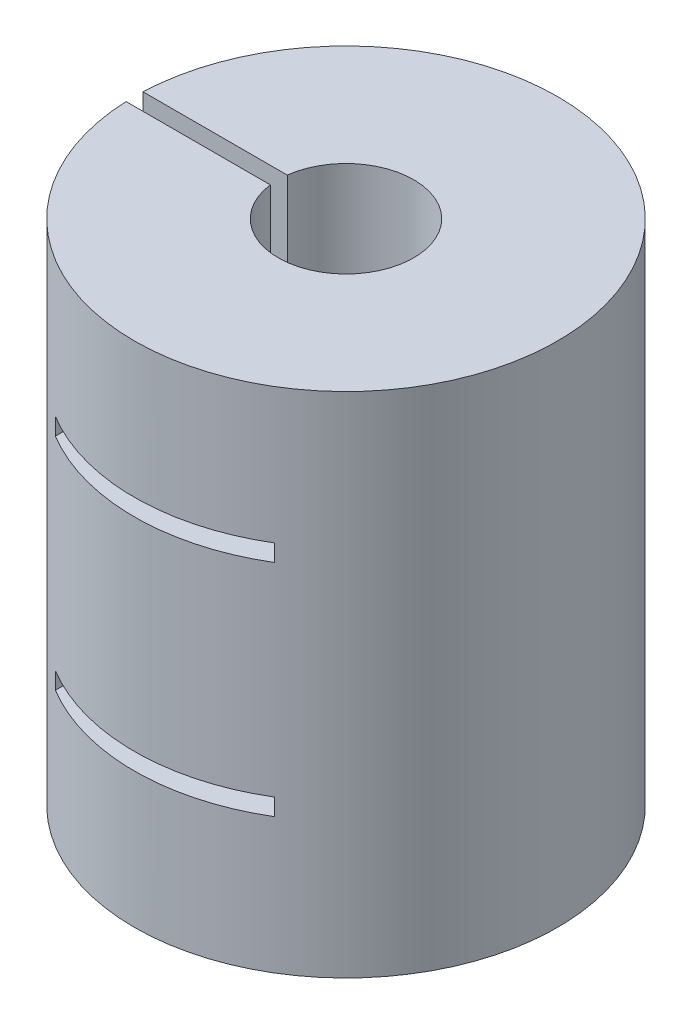
ISO-10303-21;
HEADER;
FILE_DESCRIPTION(('STEP AP214'),'2;1');
FILE_NAME('part.step','',(''),(''),'','','');
FILE_SCHEMA(('AUTOMOTIVE_DESIGN { 1 0 10303 214 1 1 1 1 }'));
ENDSEC;
DATA;
#1=APPLICATION_CONTEXT('core data for automotive mechanical design processes');
#2=APPLICATION_PROTOCOL_DEFINITION('international standard','automotive_design',2000,#1);
#3=PRODUCT_CONTEXT('',#1,'mechanical');
#4=PRODUCT('Part','Part','',(#3));
#5=PRODUCT_RELATED_PRODUCT_CATEGORY('part','',(#4));
#6=PRODUCT_DEFINITION_FORMATION('','',#4);
#7=PRODUCT_DEFINITION_CONTEXT('part definition',#1,'design');
#8=PRODUCT_DEFINITION('design','',#6,#7);
#9=PRODUCT_DEFINITION_SHAPE('','',#8);
#10=(LENGTH_UNIT() NAMED_UNIT(*) SI_UNIT(.MILLI.,.METRE.));
#11=(NAMED_UNIT(*) PLANE_ANGLE_UNIT() SI_UNIT($,.RADIAN.));
#12=(NAMED_UNIT(*) SI_UNIT($,.STERADIAN.) SOLID_ANGLE_UNIT());
#13=UNCERTAINTY_MEASURE_WITH_UNIT(LENGTH_MEASURE(1.E-05),#10,'distance_accuracy_value','');
#14=(GEOMETRIC_REPRESENTATION_CONTEXT(3) GLOBAL_UNCERTAINTY_ASSIGNED_CONTEXT((#13)) GLOBAL_UNIT_ASSIGNED_CONTEXT((#10,
#11,#12)) REPRESENTATION_CONTEXT('',''));
#15=CARTESIAN_POINT('',(0.,0.,0.));
#16=DIRECTION('',(0.,0.,1.));
#17=DIRECTION('',(1.,0.,0.));
#18=AXIS2_PLACEMENT_3D('',#15,#16,#17);
#19=CARTESIAN_POINT('',(0.,8.,0.));
#20=DIRECTION('',(0.,1.,0.));
#21=DIRECTION('',(1.,0.,0.));
#22=AXIS2_PLACEMENT_3D('',#19,#20,#21);
#23=PLANE('',#22);
#24=DIRECTION('',(1.,0.,0.));
#25=VECTOR('',#24,1.);
#26=CARTESIAN_POINT('',(-6.2449979983984,8.,-0.5));
#27=LINE('',#26,#25);
#28=CARTESIAN_POINT('',(-6.46357598434837,8.,-0.5));
#29=VERTEX_POINT('',#28);
#30=CARTESIAN_POINT('',(-2.95803989154981,8.,-0.5));
#31=VERTEX_POINT('',#30);
#32=EDGE_CURVE('E253',#29,#31,#27,.T.);
#33=ORIENTED_EDGE('',*,*,#32,.T.);
#34=CARTESIAN_POINT('',(0.,8.,0.));
#35=DIRECTION('',(0.,-1.,0.));
#36=DIRECTION('',(1.,0.,0.));
#37=AXIS2_PLACEMENT_3D('',#34,#35,#36);
#38=CIRCLE('',#37,3.);
#39=CARTESIAN_POINT('',(-2.95803989154981,8.,0.5));
#40=VERTEX_POINT('',#39);
#41=EDGE_CURVE('E11',#31,#40,#38,.T.);
#42=ORIENTED_EDGE('',*,*,#41,.T.);
#43=DIRECTION('',(1.,0.,0.));
#44=VECTOR('',#43,1.);
#45=CARTESIAN_POINT('',(-0.577243587983656,8.,0.5));
#46=LINE('',#45,#44);
#47=CARTESIAN_POINT('',(-6.46357598434837,8.,0.5));
#48=VERTEX_POINT('',#47);
#49=EDGE_CURVE('E266',#48,#40,#46,.T.);
#50=ORIENTED_EDGE('',*,*,#49,.F.);
#51=DIRECTION('',(0.,0.,-1.));
#52=VECTOR('',#51,1.);
#53=CARTESIAN_POINT('',(-6.46357598434837,8.,16.9531929419985));
#54=LINE('',#53,#52);
#55=CARTESIAN_POINT('',(-6.46357598434837,8.,10.6991675140898));
#56=VERTEX_POINT('',#55);
#57=EDGE_CURVE('E374',#56,#48,#54,.T.);
#58=ORIENTED_EDGE('',*,*,#57,.F.);
#59=CARTESIAN_POINT('',(0.,8.,0.));
#60=DIRECTION('',(0.,-1.,0.));
#61=DIRECTION('',(1.,0.,0.));
#62=AXIS2_PLACEMENT_3D('',#59,#60,#61);
#63=CIRCLE('',#62,12.5);
#64=CARTESIAN_POINT('',(6.46357598434837,8.,10.6991675140898));
#65=VERTEX_POINT('',#64);
#66=EDGE_CURVE('E245',#65,#56,#63,.T.);
#67=ORIENTED_EDGE('',*,*,#66,.F.);
#68=DIRECTION('',(0.,0.,1.));
#69=VECTOR('',#68,1.);
#70=CARTESIAN_POINT('',(6.46357598434837,8.,-16.9531929419985));
#71=LINE('',#70,#69);
#72=CARTESIAN_POINT('',(6.46357598434837,8.,-10.6991675140898));
#73=VERTEX_POINT('',#72);
#74=EDGE_CURVE('E386',#73,#65,#71,.T.);
#75=ORIENTED_EDGE('',*,*,#74,.F.);
#76=CARTESIAN_POINT('',(0.,8.,0.));
#77=DIRECTION('',(0.,-1.,0.));
#78=DIRECTION('',(1.,0.,0.));
#79=AXIS2_PLACEMENT_3D('',#76,#77,#78);
#80=CIRCLE('',#79,12.5);
#81=CARTESIAN_POINT('',(-6.46357598434837,8.,-10.6991675140898));
#82=VERTEX_POINT('',#81);
#83=EDGE_CURVE('E249',#82,#73,#80,.T.);
#84=ORIENTED_EDGE('',*,*,#83,.F.);
#85=DIRECTION('',(0.,0.,-1.));
#86=VECTOR('',#85,1.);
#87=CARTESIAN_POINT('',(-6.46357598434837,8.,16.9531929419985));
#88=LINE('',#87,#86);
#89=EDGE_CURVE('E360',#29,#82,#88,.T.);
#90=ORIENTED_EDGE('',*,*,#89,.F.);
#91=EDGE_LOOP('',(#33,#42,#50,#58,#67,#75,#84,#90));
#92=FACE_BOUND('',#91,.T.);
#93=ADVANCED_FACE('F17',(#92),#23,.T.);
#94=CARTESIAN_POINT('',(0.,30.,0.));
#95=DIRECTION('',(0.,-1.,0.));
#96=DIRECTION('',(1.,0.,0.));
#97=AXIS2_PLACEMENT_3D('',#94,#95,#96);
#98=CYLINDRICAL_SURFACE('',#97,4.);
#99=CARTESIAN_POINT('',(0.,22.,0.));
#100=DIRECTION('',(0.,-1.,0.));
#101=DIRECTION('',(-1.,0.,0.));
#102=AXIS2_PLACEMENT_3D('',#99,#100,#101);
#103=CIRCLE('',#102,4.);
#104=CARTESIAN_POINT('',(-3.96862696659689,22.,-0.5));
#105=VERTEX_POINT('',#104);
#106=CARTESIAN_POINT('',(-3.96862696659689,22.,0.5));
#107=VERTEX_POINT('',#106);
#108=EDGE_CURVE('E310',#105,#107,#103,.T.);
#109=ORIENTED_EDGE('',*,*,#108,.T.);
#110=DIRECTION('',(0.,1.,0.));
#111=VECTOR('',#110,1.);
#112=CARTESIAN_POINT('',(-3.96862696659689,30.,0.5));
#113=LINE('',#112,#111);
#114=CARTESIAN_POINT('',(-3.96862696659689,30.,0.5));
#115=VERTEX_POINT('',#114);
#116=EDGE_CURVE('E347',#107,#115,#113,.T.);
#117=ORIENTED_EDGE('',*,*,#116,.T.);
#118=CARTESIAN_POINT('',(0.,30.,0.));
#119=DIRECTION('',(0.,-1.,0.));
#120=DIRECTION('',(-1.,0.,0.));
#121=AXIS2_PLACEMENT_3D('',#118,#119,#120);
#122=CIRCLE('',#121,4.);
#123=CARTESIAN_POINT('',(-3.96862696659689,30.,-0.5));
#124=VERTEX_POINT('',#123);
#125=EDGE_CURVE('E25',#124,#115,#122,.T.);
#126=ORIENTED_EDGE('',*,*,#125,.F.);
#127=DIRECTION('',(0.,-1.,0.));
#128=VECTOR('',#127,1.);
#129=CARTESIAN_POINT('',(-3.96862696659689,30.,-0.5));
#130=LINE('',#129,#128);
#131=EDGE_CURVE('E397',#124,#105,#130,.T.);
#132=ORIENTED_EDGE('',*,*,#131,.T.);
#133=EDGE_LOOP('',(#109,#117,#126,#132));
#134=FACE_BOUND('',#133,.T.);
#135=ADVANCED_FACE('F427',(#134),#98,.F.);
#136=CARTESIAN_POINT('',(0.,0.,0.));
#137=DIRECTION('',(0.,1.,0.));
#138=DIRECTION('',(1.,0.,0.));
#139=AXIS2_PLACEMENT_3D('',#136,#137,#138);
#140=CYLINDRICAL_SURFACE('',#139,3.);
#141=DIRECTION('',(0.,-1.,0.));
#142=VECTOR('',#141,1.);
#143=CARTESIAN_POINT('',(-2.95803989154981,0.,-0.5));
#144=LINE('',#143,#142);
#145=CARTESIAN_POINT('',(-2.95803989154981,0.,-0.5));
#146=VERTEX_POINT('',#145);
#147=EDGE_CURVE('E255',#31,#146,#144,.T.);
#148=ORIENTED_EDGE('',*,*,#147,.T.);
#149=CARTESIAN_POINT('',(0.,0.,0.));
#150=DIRECTION('',(0.,1.,0.));
#151=DIRECTION('',(1.,0.,0.));
#152=AXIS2_PLACEMENT_3D('',#149,#150,#151);
#153=CIRCLE('',#152,3.);
#154=CARTESIAN_POINT('',(-2.95803989154981,0.,0.5));
#155=VERTEX_POINT('',#154);
#156=EDGE_CURVE('E45',#155,#146,#153,.T.);
#157=ORIENTED_EDGE('',*,*,#156,.F.);
#158=DIRECTION('',(0.,1.,0.));
#159=VECTOR('',#158,1.);
#160=CARTESIAN_POINT('',(-2.95803989154981,0.,0.5));
#161=LINE('',#160,#159);
#162=EDGE_CURVE('E334',#155,#40,#161,.T.);
#163=ORIENTED_EDGE('',*,*,#162,.T.);
#164=ORIENTED_EDGE('',*,*,#41,.F.);
#165=EDGE_LOOP('',(#148,#157,#163,#164));
#166=FACE_BOUND('',#165,.T.);
#167=ADVANCED_FACE('F462',(#166),#140,.F.);
#168=CARTESIAN_POINT('',(0.,30.,0.));
#169=DIRECTION('',(0.,1.,0.));
#170=DIRECTION('',(1.,0.,0.));
#171=AXIS2_PLACEMENT_3D('',#168,#169,#170);
#172=PLANE('',#171);
#173=DIRECTION('',(1.,0.,0.));
#174=VECTOR('',#173,1.);
#175=CARTESIAN_POINT('',(-6.2449979983984,30.,-0.5));
#176=LINE('',#175,#174);
#177=CARTESIAN_POINT('',(-12.4899959967968,30.,-0.5));
#178=VERTEX_POINT('',#177);
#179=EDGE_CURVE('E392',#178,#124,#176,.T.);
#180=ORIENTED_EDGE('',*,*,#179,.T.);
#181=ORIENTED_EDGE('',*,*,#125,.T.);
#182=DIRECTION('',(-1.,0.,0.));
#183=VECTOR('',#182,1.);
#184=CARTESIAN_POINT('',(-0.577243587983656,30.,0.5));
#185=LINE('',#184,#183);
#186=CARTESIAN_POINT('',(-12.4899959967968,30.,0.5));
#187=VERTEX_POINT('',#186);
#188=EDGE_CURVE('E343',#115,#187,#185,.T.);
#189=ORIENTED_EDGE('',*,*,#188,.T.);
#190=CARTESIAN_POINT('',(0.,30.,0.));
#191=DIRECTION('',(0.,1.,0.));
#192=DIRECTION('',(1.,0.,0.));
#193=AXIS2_PLACEMENT_3D('',#190,#191,#192);
#194=CIRCLE('',#193,12.5);
#195=EDGE_CURVE('E250',#187,#178,#194,.T.);
#196=ORIENTED_EDGE('',*,*,#195,.T.);
#197=EDGE_LOOP('',(#180,#181,#189,#196));
#198=FACE_BOUND('',#197,.T.);
#199=ADVANCED_FACE('F421',(#198),#172,.T.);
#200=CARTESIAN_POINT('',(0.,0.,0.));
#201=DIRECTION('',(0.,1.,0.));
#202=DIRECTION('',(1.,0.,0.));
#203=AXIS2_PLACEMENT_3D('',#200,#201,#202);
#204=PLANE('',#203);
#205=DIRECTION('',(-1.,0.,0.));
#206=VECTOR('',#205,1.);
#207=CARTESIAN_POINT('',(-6.2449979983984,0.,-0.5));
#208=LINE('',#207,#206);
#209=CARTESIAN_POINT('',(-12.4899959967968,0.,-0.5));
#210=VERTEX_POINT('',#209);
#211=EDGE_CURVE('E408',#146,#210,#208,.T.);
#212=ORIENTED_EDGE('',*,*,#211,.T.);
#213=CARTESIAN_POINT('',(0.,0.,0.));
#214=DIRECTION('',(0.,1.,0.));
#215=DIRECTION('',(1.,0.,0.));
#216=AXIS2_PLACEMENT_3D('',#213,#214,#215);
#217=CIRCLE('',#216,12.5);
#218=CARTESIAN_POINT('',(-12.4899959967968,0.,0.5));
#219=VERTEX_POINT('',#218);
#220=EDGE_CURVE('E246',#219,#210,#217,.T.);
#221=ORIENTED_EDGE('',*,*,#220,.F.);
#222=DIRECTION('',(1.,0.,0.));
#223=VECTOR('',#222,1.);
#224=CARTESIAN_POINT('',(-0.577243587983656,0.,0.5));
#225=LINE('',#224,#223);
#226=EDGE_CURVE('E337',#219,#155,#225,.T.);
#227=ORIENTED_EDGE('',*,*,#226,.T.);
#228=ORIENTED_EDGE('',*,*,#156,.T.);
#229=EDGE_LOOP('',(#212,#221,#227,#228));
#230=FACE_BOUND('',#229,.T.);
#231=ADVANCED_FACE('F464',(#230),#204,.F.);
#232=CARTESIAN_POINT('',(0.,0.,0.));
#233=DIRECTION('',(0.,1.,0.));
#234=DIRECTION('',(1.,0.,0.));
#235=AXIS2_PLACEMENT_3D('',#232,#233,#234);
#236=CYLINDRICAL_SURFACE('',#235,12.5);
#237=DIRECTION('',(0.,-1.,0.));
#238=VECTOR('',#237,1.);
#239=CARTESIAN_POINT('',(6.46357598434837,0.,10.6991675140898));
#240=LINE('',#239,#238);
#241=CARTESIAN_POINT('',(6.46357598434837,9.,10.6991675140898));
#242=VERTEX_POINT('',#241);
#243=EDGE_CURVE('E379',#242,#65,#240,.T.);
#244=ORIENTED_EDGE('',*,*,#243,.T.);
#245=ORIENTED_EDGE('',*,*,#66,.T.);
#246=DIRECTION('',(0.,1.,0.));
#247=VECTOR('',#246,1.);
#248=CARTESIAN_POINT('',(-6.46357598434837,0.,10.6991675140898));
#249=LINE('',#248,#247);
#250=CARTESIAN_POINT('',(-6.46357598434837,9.,10.6991675140898));
#251=VERTEX_POINT('',#250);
#252=EDGE_CURVE('E370',#56,#251,#249,.T.);
#253=ORIENTED_EDGE('',*,*,#252,.T.);
#254=CARTESIAN_POINT('',(0.,9.,0.));
#255=DIRECTION('',(0.,1.,0.));
#256=DIRECTION('',(1.,0.,0.));
#257=AXIS2_PLACEMENT_3D('',#254,#255,#256);
#258=CIRCLE('',#257,12.5);
#259=EDGE_CURVE('E276',#251,#242,#258,.T.);
#260=ORIENTED_EDGE('',*,*,#259,.T.);
#261=EDGE_LOOP('',(#244,#245,#253,#260));
#262=FACE_BOUND('',#261,.T.);
#263=DIRECTION('',(0.,1.,0.));
#264=VECTOR('',#263,1.);
#265=CARTESIAN_POINT('',(6.46357598434837,0.,-10.6991675140898));
#266=LINE('',#265,#264);
#267=CARTESIAN_POINT('',(6.46357598434837,9.,-10.6991675140898));
#268=VERTEX_POINT('',#267);
#269=EDGE_CURVE('E382',#73,#268,#266,.T.);
#270=ORIENTED_EDGE('',*,*,#269,.T.);
#271=CARTESIAN_POINT('',(0.,9.,0.));
#272=DIRECTION('',(0.,1.,0.));
#273=DIRECTION('',(1.,0.,0.));
#274=AXIS2_PLACEMENT_3D('',#271,#272,#273);
#275=CIRCLE('',#274,12.5);
#276=CARTESIAN_POINT('',(-6.46357598434837,9.,-10.6991675140898));
#277=VERTEX_POINT('',#276);
#278=EDGE_CURVE('E273',#268,#277,#275,.T.);
#279=ORIENTED_EDGE('',*,*,#278,.T.);
#280=DIRECTION('',(0.,-1.,0.));
#281=VECTOR('',#280,1.);
#282=CARTESIAN_POINT('',(-6.46357598434837,0.,-10.6991675140898));
#283=LINE('',#282,#281);
#284=EDGE_CURVE('E286',#277,#82,#283,.T.);
#285=ORIENTED_EDGE('',*,*,#284,.T.);
#286=ORIENTED_EDGE('',*,*,#83,.T.);
#287=EDGE_LOOP('',(#270,#279,#285,#286));
#288=FACE_BOUND('',#287,.T.);
#289=DIRECTION('',(0.,-1.,0.));
#290=VECTOR('',#289,1.);
#291=CARTESIAN_POINT('',(6.46357598434837,0.,10.6991675140898));
#292=LINE('',#291,#290);
#293=CARTESIAN_POINT('',(6.46357598434837,22.,10.6991675140898));
#294=VERTEX_POINT('',#293);
#295=CARTESIAN_POINT('',(6.46357598434837,21.,10.6991675140898));
#296=VERTEX_POINT('',#295);
#297=EDGE_CURVE('E302',#294,#296,#292,.T.);
#298=ORIENTED_EDGE('',*,*,#297,.T.);
#299=CARTESIAN_POINT('',(0.,21.,0.));
#300=DIRECTION('',(0.,-1.,0.));
#301=DIRECTION('',(1.,0.,0.));
#302=AXIS2_PLACEMENT_3D('',#299,#300,#301);
#303=CIRCLE('',#302,12.5);
#304=CARTESIAN_POINT('',(-6.46357598434837,21.,10.6991675140898));
#305=VERTEX_POINT('',#304);
#306=EDGE_CURVE('E241',#296,#305,#303,.T.);
#307=ORIENTED_EDGE('',*,*,#306,.T.);
#308=DIRECTION('',(0.,1.,0.));
#309=VECTOR('',#308,1.);
#310=CARTESIAN_POINT('',(-6.46357598434837,0.,10.6991675140898));
#311=LINE('',#310,#309);
#312=CARTESIAN_POINT('',(-6.46357598434837,22.,10.6991675140898));
#313=VERTEX_POINT('',#312);
#314=EDGE_CURVE('E290',#305,#313,#311,.T.);
#315=ORIENTED_EDGE('',*,*,#314,.T.);
#316=CARTESIAN_POINT('',(0.,22.,0.));
#317=DIRECTION('',(0.,1.,0.));
#318=DIRECTION('',(1.,0.,0.));
#319=AXIS2_PLACEMENT_3D('',#316,#317,#318);
#320=CIRCLE('',#319,12.5);
#321=EDGE_CURVE('E326',#313,#294,#320,.T.);
#322=ORIENTED_EDGE('',*,*,#321,.T.);
#323=EDGE_LOOP('',(#298,#307,#315,#322));
#324=FACE_BOUND('',#323,.T.);
#325=DIRECTION('',(0.,1.,0.));
#326=VECTOR('',#325,1.);
#327=CARTESIAN_POINT('',(6.46357598434837,0.,-10.6991675140898));
#328=LINE('',#327,#326);
#329=CARTESIAN_POINT('',(6.46357598434837,21.,-10.6991675140898));
#330=VERTEX_POINT('',#329);
#331=CARTESIAN_POINT('',(6.46357598434837,22.,-10.6991675140898));
#332=VERTEX_POINT('',#331);
#333=EDGE_CURVE('E238',#330,#332,#328,.T.);
#334=ORIENTED_EDGE('',*,*,#333,.T.);
#335=CARTESIAN_POINT('',(0.,22.,0.));
#336=DIRECTION('',(0.,1.,0.));
#337=DIRECTION('',(1.,0.,0.));
#338=AXIS2_PLACEMENT_3D('',#335,#336,#337);
#339=CIRCLE('',#338,12.5);
#340=CARTESIAN_POINT('',(-6.46357598434837,22.,-10.6991675140898));
#341=VERTEX_POINT('',#340);
#342=EDGE_CURVE('E321',#332,#341,#339,.T.);
#343=ORIENTED_EDGE('',*,*,#342,.T.);
#344=DIRECTION('',(0.,-1.,0.));
#345=VECTOR('',#344,1.);
#346=CARTESIAN_POINT('',(-6.46357598434837,0.,-10.6991675140898));
#347=LINE('',#346,#345);
#348=CARTESIAN_POINT('',(-6.46357598434837,21.,-10.6991675140898));
#349=VERTEX_POINT('',#348);
#350=EDGE_CURVE('E223',#341,#349,#347,.T.);
#351=ORIENTED_EDGE('',*,*,#350,.T.);
#352=CARTESIAN_POINT('',(0.,21.,0.));
#353=DIRECTION('',(0.,-1.,0.));
#354=DIRECTION('',(1.,0.,0.));
#355=AXIS2_PLACEMENT_3D('',#352,#353,#354);
#356=CIRCLE('',#355,12.5);
#357=EDGE_CURVE('E212',#349,#330,#356,.T.);
#358=ORIENTED_EDGE('',*,*,#357,.T.);
#359=EDGE_LOOP('',(#334,#343,#351,#358));
#360=FACE_BOUND('',#359,.T.);
#361=DIRECTION('',(0.,1.,0.));
#362=VECTOR('',#361,1.);
#363=CARTESIAN_POINT('',(-12.4899959967968,0.,-0.5));
#364=LINE('',#363,#362);
#365=EDGE_CURVE('E396',#210,#178,#364,.T.);
#366=ORIENTED_EDGE('',*,*,#365,.T.);
#367=ORIENTED_EDGE('',*,*,#195,.F.);
#368=DIRECTION('',(0.,-1.,0.));
#369=VECTOR('',#368,1.);
#370=CARTESIAN_POINT('',(-12.4899959967968,0.,0.5));
#371=LINE('',#370,#369);
#372=EDGE_CURVE('E339',#187,#219,#371,.T.);
#373=ORIENTED_EDGE('',*,*,#372,.T.);
#374=ORIENTED_EDGE('',*,*,#220,.T.);
#375=EDGE_LOOP('',(#366,#367,#373,#374));
#376=FACE_BOUND('',#375,.T.);
#377=ADVANCED_FACE('F435',(#262,#288,#324,#360,#376),#236,.T.);
#378=CARTESIAN_POINT('',(-12.4899959967968,30.,-0.5));
#379=DIRECTION('',(0.,0.,-1.));
#380=DIRECTION('',(0.,-1.,0.));
#381=AXIS2_PLACEMENT_3D('',#378,#379,#380);
#382=PLANE('',#381);
#383=DIRECTION('',(1.,0.,0.));
#384=VECTOR('',#383,1.);
#385=CARTESIAN_POINT('',(-6.2449979983984,22.,-0.5));
#386=LINE('',#385,#384);
#387=CARTESIAN_POINT('',(-6.46357598434837,22.,-0.5));
#388=VERTEX_POINT('',#387);
#389=EDGE_CURVE('E314',#388,#105,#386,.T.);
#390=ORIENTED_EDGE('',*,*,#389,.T.);
#391=ORIENTED_EDGE('',*,*,#131,.F.);
#392=ORIENTED_EDGE('',*,*,#179,.F.);
#393=ORIENTED_EDGE('',*,*,#365,.F.);
#394=ORIENTED_EDGE('',*,*,#211,.F.);
#395=ORIENTED_EDGE('',*,*,#147,.F.);
#396=ORIENTED_EDGE('',*,*,#32,.F.);
#397=DIRECTION('',(0.,1.,0.));
#398=VECTOR('',#397,1.);
#399=CARTESIAN_POINT('',(-6.46357598434837,19.,-0.5));
#400=LINE('',#399,#398);
#401=CARTESIAN_POINT('',(-6.46357598434837,9.,-0.5));
#402=VERTEX_POINT('',#401);
#403=EDGE_CURVE('E356',#29,#402,#400,.T.);
#404=ORIENTED_EDGE('',*,*,#403,.T.);
#405=DIRECTION('',(1.,0.,0.));
#406=VECTOR('',#405,1.);
#407=CARTESIAN_POINT('',(-6.2449979983984,9.,-0.5));
#408=LINE('',#407,#406);
#409=CARTESIAN_POINT('',(-3.96862696659689,9.,-0.5));
#410=VERTEX_POINT('',#409);
#411=EDGE_CURVE('E277',#402,#410,#408,.T.);
#412=ORIENTED_EDGE('',*,*,#411,.T.);
#413=DIRECTION('',(0.,-1.,0.));
#414=VECTOR('',#413,1.);
#415=CARTESIAN_POINT('',(-3.96862696659689,30.,-0.5));
#416=LINE('',#415,#414);
#417=CARTESIAN_POINT('',(-3.96862696659689,21.,-0.5));
#418=VERTEX_POINT('',#417);
#419=EDGE_CURVE('E206',#418,#410,#416,.T.);
#420=ORIENTED_EDGE('',*,*,#419,.F.);
#421=DIRECTION('',(-1.,0.,0.));
#422=VECTOR('',#421,1.);
#423=CARTESIAN_POINT('',(-6.2449979983984,21.,-0.5));
#424=LINE('',#423,#422);
#425=CARTESIAN_POINT('',(-6.46357598434837,21.,-0.5));
#426=VERTEX_POINT('',#425);
#427=EDGE_CURVE('E199',#418,#426,#424,.T.);
#428=ORIENTED_EDGE('',*,*,#427,.T.);
#429=DIRECTION('',(0.,1.,0.));
#430=VECTOR('',#429,1.);
#431=CARTESIAN_POINT('',(-6.46357598434837,26.,-0.5));
#432=LINE('',#431,#430);
#433=EDGE_CURVE('E204',#426,#388,#432,.T.);
#434=ORIENTED_EDGE('',*,*,#433,.T.);
#435=EDGE_LOOP('',(#390,#391,#392,#393,#394,#395,#396,#404,#412,#420,#428,#434));
#436=FACE_BOUND('',#435,.T.);
#437=ADVANCED_FACE('F202',(#436),#382,.F.);
#438=CARTESIAN_POINT('',(0.,9.,0.));
#439=DIRECTION('',(0.,1.,0.));
#440=DIRECTION('',(1.,0.,0.));
#441=AXIS2_PLACEMENT_3D('',#438,#439,#440);
#442=PLANE('',#441);
#443=DIRECTION('',(-1.,0.,0.));
#444=VECTOR('',#443,1.);
#445=CARTESIAN_POINT('',(-0.577243587983656,9.,0.5));
#446=LINE('',#445,#444);
#447=CARTESIAN_POINT('',(-3.96862696659689,9.,0.5));
#448=VERTEX_POINT('',#447);
#449=CARTESIAN_POINT('',(-6.46357598434837,9.,0.5));
#450=VERTEX_POINT('',#449);
#451=EDGE_CURVE('E267',#448,#450,#446,.T.);
#452=ORIENTED_EDGE('',*,*,#451,.F.);
#453=CARTESIAN_POINT('',(0.,9.,0.));
#454=DIRECTION('',(0.,-1.,0.));
#455=DIRECTION('',(-1.,0.,0.));
#456=AXIS2_PLACEMENT_3D('',#453,#454,#455);
#457=CIRCLE('',#456,4.);
#458=EDGE_CURVE('E353',#410,#448,#457,.T.);
#459=ORIENTED_EDGE('',*,*,#458,.F.);
#460=ORIENTED_EDGE('',*,*,#411,.F.);
#461=DIRECTION('',(0.,0.,1.));
#462=VECTOR('',#461,1.);
#463=CARTESIAN_POINT('',(-6.46357598434837,9.,16.9531929419985));
#464=LINE('',#463,#462);
#465=EDGE_CURVE('E281',#277,#402,#464,.T.);
#466=ORIENTED_EDGE('',*,*,#465,.F.);
#467=ORIENTED_EDGE('',*,*,#278,.F.);
#468=DIRECTION('',(0.,0.,-1.));
#469=VECTOR('',#468,1.);
#470=CARTESIAN_POINT('',(6.46357598434837,9.,-16.9531929419985));
#471=LINE('',#470,#469);
#472=EDGE_CURVE('E375',#242,#268,#471,.T.);
#473=ORIENTED_EDGE('',*,*,#472,.F.);
#474=ORIENTED_EDGE('',*,*,#259,.F.);
#475=DIRECTION('',(0.,0.,1.));
#476=VECTOR('',#475,1.);
#477=CARTESIAN_POINT('',(-6.46357598434837,9.,16.9531929419985));
#478=LINE('',#477,#476);
#479=EDGE_CURVE('E285',#450,#251,#478,.T.);
#480=ORIENTED_EDGE('',*,*,#479,.F.);
#481=EDGE_LOOP('',(#452,#459,#460,#466,#467,#473,#474,#480));
#482=FACE_BOUND('',#481,.T.);
#483=ADVANCED_FACE('F454',(#482),#442,.F.);
#484=CARTESIAN_POINT('',(6.46357598434837,8.,16.9531929419985));
#485=DIRECTION('',(1.,0.,0.));
#486=DIRECTION('',(0.,0.,-1.));
#487=AXIS2_PLACEMENT_3D('',#484,#485,#486);
#488=PLANE('',#487);
#489=ORIENTED_EDGE('',*,*,#269,.F.);
#490=ORIENTED_EDGE('',*,*,#74,.T.);
#491=ORIENTED_EDGE('',*,*,#243,.F.);
#492=ORIENTED_EDGE('',*,*,#472,.T.);
#493=EDGE_LOOP('',(#489,#490,#491,#492));
#494=FACE_BOUND('',#493,.T.);
#495=ADVANCED_FACE('F476',(#494),#488,.F.);
#496=CARTESIAN_POINT('',(-6.46357598434837,8.,-16.9531929419985));
#497=DIRECTION('',(-1.,0.,0.));
#498=DIRECTION('',(0.,0.,1.));
#499=AXIS2_PLACEMENT_3D('',#496,#497,#498);
#500=PLANE('',#499);
#501=DIRECTION('',(0.,-1.,0.));
#502=VECTOR('',#501,1.);
#503=CARTESIAN_POINT('',(-6.46357598434837,19.,0.5));
#504=LINE('',#503,#502);
#505=EDGE_CURVE('E262',#450,#48,#504,.T.);
#506=ORIENTED_EDGE('',*,*,#505,.F.);
#507=ORIENTED_EDGE('',*,*,#479,.T.);
#508=ORIENTED_EDGE('',*,*,#252,.F.);
#509=ORIENTED_EDGE('',*,*,#57,.T.);
#510=EDGE_LOOP('',(#506,#507,#508,#509));
#511=FACE_BOUND('',#510,.T.);
#512=ADVANCED_FACE('F458',(#511),#500,.F.);
#513=CARTESIAN_POINT('',(-6.46357598434837,8.,-16.9531929419985));
#514=DIRECTION('',(-1.,0.,0.));
#515=DIRECTION('',(0.,0.,1.));
#516=AXIS2_PLACEMENT_3D('',#513,#514,#515);
#517=PLANE('',#516);
#518=ORIENTED_EDGE('',*,*,#403,.F.);
#519=ORIENTED_EDGE('',*,*,#89,.T.);
#520=ORIENTED_EDGE('',*,*,#284,.F.);
#521=ORIENTED_EDGE('',*,*,#465,.T.);
#522=EDGE_LOOP('',(#518,#519,#520,#521));
#523=FACE_BOUND('',#522,.T.);
#524=ADVANCED_FACE('F470',(#523),#517,.F.);
#525=CARTESIAN_POINT('',(0.,30.,0.));
#526=DIRECTION('',(0.,-1.,0.));
#527=DIRECTION('',(1.,0.,0.));
#528=AXIS2_PLACEMENT_3D('',#525,#526,#527);
#529=CYLINDRICAL_SURFACE('',#528,4.);
#530=CARTESIAN_POINT('',(0.,21.,0.));
#531=DIRECTION('',(0.,1.,0.));
#532=DIRECTION('',(-1.,0.,0.));
#533=AXIS2_PLACEMENT_3D('',#530,#531,#532);
#534=CIRCLE('',#533,4.);
#535=CARTESIAN_POINT('',(-3.96862696659689,21.,0.5));
#536=VERTEX_POINT('',#535);
#537=EDGE_CURVE('E211',#536,#418,#534,.T.);
#538=ORIENTED_EDGE('',*,*,#537,.T.);
#539=ORIENTED_EDGE('',*,*,#419,.T.);
#540=ORIENTED_EDGE('',*,*,#458,.T.);
#541=DIRECTION('',(0.,1.,0.));
#542=VECTOR('',#541,1.);
#543=CARTESIAN_POINT('',(-3.96862696659689,30.,0.5));
#544=LINE('',#543,#542);
#545=EDGE_CURVE('E306',#448,#536,#544,.T.);
#546=ORIENTED_EDGE('',*,*,#545,.T.);
#547=EDGE_LOOP('',(#538,#539,#540,#546));
#548=FACE_BOUND('',#547,.T.);
#549=ADVANCED_FACE('F449',(#548),#529,.F.);
#550=CARTESIAN_POINT('',(-1.15448717596731,30.,0.5));
#551=DIRECTION('',(0.,0.,1.));
#552=DIRECTION('',(1.,0.,0.));
#553=AXIS2_PLACEMENT_3D('',#550,#551,#552);
#554=PLANE('',#553);
#555=DIRECTION('',(-1.,0.,0.));
#556=VECTOR('',#555,1.);
#557=CARTESIAN_POINT('',(-0.577243587983656,22.,0.5));
#558=LINE('',#557,#556);
#559=CARTESIAN_POINT('',(-6.46357598434837,22.,0.5));
#560=VERTEX_POINT('',#559);
#561=EDGE_CURVE('E315',#107,#560,#558,.T.);
#562=ORIENTED_EDGE('',*,*,#561,.T.);
#563=DIRECTION('',(0.,-1.,0.));
#564=VECTOR('',#563,1.);
#565=CARTESIAN_POINT('',(-6.46357598434837,26.,0.5));
#566=LINE('',#565,#564);
#567=CARTESIAN_POINT('',(-6.46357598434837,21.,0.5));
#568=VERTEX_POINT('',#567);
#569=EDGE_CURVE('E259',#560,#568,#566,.T.);
#570=ORIENTED_EDGE('',*,*,#569,.T.);
#571=DIRECTION('',(1.,0.,0.));
#572=VECTOR('',#571,1.);
#573=CARTESIAN_POINT('',(-0.577243587983656,21.,0.5));
#574=LINE('',#573,#572);
#575=EDGE_CURVE('E268',#568,#536,#574,.T.);
#576=ORIENTED_EDGE('',*,*,#575,.T.);
#577=ORIENTED_EDGE('',*,*,#545,.F.);
#578=ORIENTED_EDGE('',*,*,#451,.T.);
#579=ORIENTED_EDGE('',*,*,#505,.T.);
#580=ORIENTED_EDGE('',*,*,#49,.T.);
#581=ORIENTED_EDGE('',*,*,#162,.F.);
#582=ORIENTED_EDGE('',*,*,#226,.F.);
#583=ORIENTED_EDGE('',*,*,#372,.F.);
#584=ORIENTED_EDGE('',*,*,#188,.F.);
#585=ORIENTED_EDGE('',*,*,#116,.F.);
#586=EDGE_LOOP('',(#562,#570,#576,#577,#578,#579,#580,#581,#582,#583,#584,#585));
#587=FACE_BOUND('',#586,.T.);
#588=ADVANCED_FACE('F431',(#587),#554,.F.);
#589=CARTESIAN_POINT('',(0.,22.,0.));
#590=DIRECTION('',(0.,1.,0.));
#591=DIRECTION('',(1.,0.,0.));
#592=AXIS2_PLACEMENT_3D('',#589,#590,#591);
#593=PLANE('',#592);
#594=ORIENTED_EDGE('',*,*,#561,.F.);
#595=ORIENTED_EDGE('',*,*,#108,.F.);
#596=ORIENTED_EDGE('',*,*,#389,.F.);
#597=DIRECTION('',(0.,0.,-1.));
#598=VECTOR('',#597,1.);
#599=CARTESIAN_POINT('',(-6.46357598434837,22.,16.9531929419985));
#600=LINE('',#599,#598);
#601=EDGE_CURVE('E228',#388,#341,#600,.T.);
#602=ORIENTED_EDGE('',*,*,#601,.T.);
#603=ORIENTED_EDGE('',*,*,#342,.F.);
#604=DIRECTION('',(0.,0.,1.));
#605=VECTOR('',#604,1.);
#606=CARTESIAN_POINT('',(6.46357598434837,22.,-16.9531929419985));
#607=LINE('',#606,#605);
#608=EDGE_CURVE('E309',#332,#294,#607,.T.);
#609=ORIENTED_EDGE('',*,*,#608,.T.);
#610=ORIENTED_EDGE('',*,*,#321,.F.);
#611=DIRECTION('',(0.,0.,-1.));
#612=VECTOR('',#611,1.);
#613=CARTESIAN_POINT('',(-6.46357598434837,22.,16.9531929419985));
#614=LINE('',#613,#612);
#615=EDGE_CURVE('E280',#313,#560,#614,.T.);
#616=ORIENTED_EDGE('',*,*,#615,.T.);
#617=EDGE_LOOP('',(#594,#595,#596,#602,#603,#609,#610,#616));
#618=FACE_BOUND('',#617,.T.);
#619=ADVANCED_FACE('F439',(#618),#593,.F.);
#620=CARTESIAN_POINT('',(6.46357598434837,22.,16.9531929419985));
#621=DIRECTION('',(-1.,0.,0.));
#622=DIRECTION('',(0.,1.,0.));
#623=AXIS2_PLACEMENT_3D('',#620,#621,#622);
#624=PLANE('',#623);
#625=ORIENTED_EDGE('',*,*,#333,.F.);
#626=DIRECTION('',(0.,0.,-1.));
#627=VECTOR('',#626,1.);
#628=CARTESIAN_POINT('',(6.46357598434837,21.,-16.9531929419985));
#629=LINE('',#628,#627);
#630=EDGE_CURVE('E239',#296,#330,#629,.T.);
#631=ORIENTED_EDGE('',*,*,#630,.F.);
#632=ORIENTED_EDGE('',*,*,#297,.F.);
#633=ORIENTED_EDGE('',*,*,#608,.F.);
#634=EDGE_LOOP('',(#625,#631,#632,#633));
#635=FACE_BOUND('',#634,.T.);
#636=ADVANCED_FACE('F508',(#635),#624,.T.);
#637=CARTESIAN_POINT('',(0.,21.,0.));
#638=DIRECTION('',(0.,1.,0.));
#639=DIRECTION('',(1.,0.,0.));
#640=AXIS2_PLACEMENT_3D('',#637,#638,#639);
#641=PLANE('',#640);
#642=ORIENTED_EDGE('',*,*,#575,.F.);
#643=DIRECTION('',(0.,0.,1.));
#644=VECTOR('',#643,1.);
#645=CARTESIAN_POINT('',(-6.46357598434837,21.,16.9531929419985));
#646=LINE('',#645,#644);
#647=EDGE_CURVE('E272',#568,#305,#646,.T.);
#648=ORIENTED_EDGE('',*,*,#647,.T.);
#649=ORIENTED_EDGE('',*,*,#306,.F.);
#650=ORIENTED_EDGE('',*,*,#630,.T.);
#651=ORIENTED_EDGE('',*,*,#357,.F.);
#652=DIRECTION('',(0.,0.,1.));
#653=VECTOR('',#652,1.);
#654=CARTESIAN_POINT('',(-6.46357598434837,21.,16.9531929419985));
#655=LINE('',#654,#653);
#656=EDGE_CURVE('E215',#349,#426,#655,.T.);
#657=ORIENTED_EDGE('',*,*,#656,.T.);
#658=ORIENTED_EDGE('',*,*,#427,.F.);
#659=ORIENTED_EDGE('',*,*,#537,.F.);
#660=EDGE_LOOP('',(#642,#648,#649,#650,#651,#657,#658,#659));
#661=FACE_BOUND('',#660,.T.);
#662=ADVANCED_FACE('F216',(#661),#641,.T.);
#663=CARTESIAN_POINT('',(-6.46357598434837,22.,-16.9531929419985));
#664=DIRECTION('',(1.,0.,0.));
#665=DIRECTION('',(0.,1.,0.));
#666=AXIS2_PLACEMENT_3D('',#663,#664,#665);
#667=PLANE('',#666);
#668=ORIENTED_EDGE('',*,*,#569,.F.);
#669=ORIENTED_EDGE('',*,*,#615,.F.);
#670=ORIENTED_EDGE('',*,*,#314,.F.);
#671=ORIENTED_EDGE('',*,*,#647,.F.);
#672=EDGE_LOOP('',(#668,#669,#670,#671));
#673=FACE_BOUND('',#672,.T.);
#674=ADVANCED_FACE('F445',(#673),#667,.T.);
#675=CARTESIAN_POINT('',(-6.46357598434837,22.,-16.9531929419985));
#676=DIRECTION('',(1.,0.,0.));
#677=DIRECTION('',(0.,1.,0.));
#678=AXIS2_PLACEMENT_3D('',#675,#676,#677);
#679=PLANE('',#678);
#680=ORIENTED_EDGE('',*,*,#433,.F.);
#681=ORIENTED_EDGE('',*,*,#656,.F.);
#682=ORIENTED_EDGE('',*,*,#350,.F.);
#683=ORIENTED_EDGE('',*,*,#601,.F.);
#684=EDGE_LOOP('',(#680,#681,#682,#683));
#685=FACE_BOUND('',#684,.T.);
#686=ADVANCED_FACE('F226',(#685),#679,.T.);
#687=CLOSED_SHELL('',(#93,#135,#167,#199,#231,#377,#437,#483,#495,#512,#524,#549,#588,#619,#636,
#662,#674,#686));
#688=MANIFOLD_SOLID_BREP('B1',#687);
#689=ADVANCED_BREP_SHAPE_REPRESENTATION('',(#18,#688),#14);
#690=SHAPE_DEFINITION_REPRESENTATION(#9,#689);
ENDSEC;
END-ISO-10303-21;
